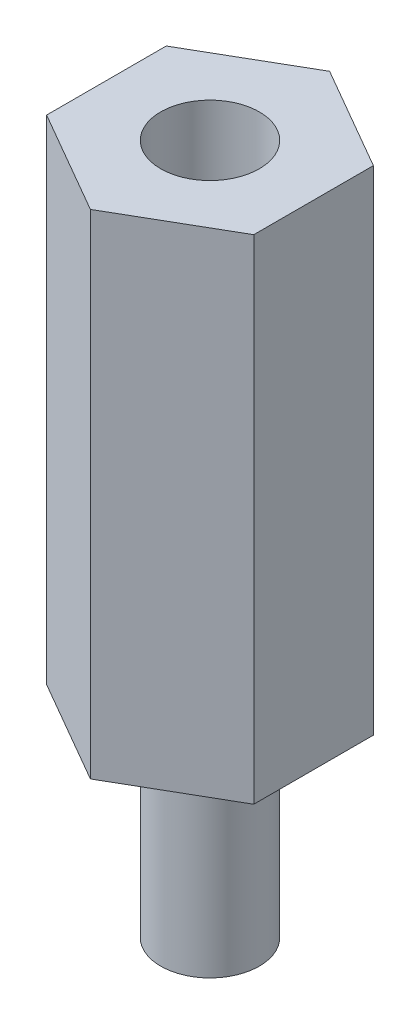
ISO-10303-21;
HEADER;
FILE_DESCRIPTION(('STEP AP214'),'2;1');
FILE_NAME('part.step','',(''),(''),'','','');
FILE_SCHEMA(('AUTOMOTIVE_DESIGN { 1 0 10303 214 1 1 1 1 }'));
ENDSEC;
DATA;
#1=APPLICATION_CONTEXT('core data for automotive mechanical design processes');
#2=APPLICATION_PROTOCOL_DEFINITION('international standard','automotive_design',2000,#1);
#3=PRODUCT_CONTEXT('',#1,'mechanical');
#4=PRODUCT('Part','Part','',(#3));
#5=PRODUCT_RELATED_PRODUCT_CATEGORY('part','',(#4));
#6=PRODUCT_DEFINITION_FORMATION('','',#4);
#7=PRODUCT_DEFINITION_CONTEXT('part definition',#1,'design');
#8=PRODUCT_DEFINITION('design','',#6,#7);
#9=PRODUCT_DEFINITION_SHAPE('','',#8);
#10=(LENGTH_UNIT() NAMED_UNIT(*) SI_UNIT(.MILLI.,.METRE.));
#11=(NAMED_UNIT(*) PLANE_ANGLE_UNIT() SI_UNIT($,.RADIAN.));
#12=(NAMED_UNIT(*) SI_UNIT($,.STERADIAN.) SOLID_ANGLE_UNIT());
#13=UNCERTAINTY_MEASURE_WITH_UNIT(LENGTH_MEASURE(1.E-05),#10,'distance_accuracy_value','');
#14=(GEOMETRIC_REPRESENTATION_CONTEXT(3) GLOBAL_UNCERTAINTY_ASSIGNED_CONTEXT((#13)) GLOBAL_UNIT_ASSIGNED_CONTEXT((#10,
#11,#12)) REPRESENTATION_CONTEXT('',''));
#15=CARTESIAN_POINT('',(0.,0.,0.));
#16=DIRECTION('',(0.,0.,1.));
#17=DIRECTION('',(1.,0.,0.));
#18=AXIS2_PLACEMENT_3D('',#15,#16,#17);
#19=CARTESIAN_POINT('',(3.15,15.,-1.81865334794732));
#20=DIRECTION('',(-0.5,0.,0.866025403784439));
#21=DIRECTION('',(0.866025403784439,0.,0.5));
#22=AXIS2_PLACEMENT_3D('',#19,#20,#21);
#23=PLANE('',#22);
#24=DIRECTION('',(-0.866025403784439,0.,-0.5));
#25=VECTOR('',#24,1.);
#26=CARTESIAN_POINT('',(3.15,0.,-1.81865334794732));
#27=LINE('',#26,#25);
#28=CARTESIAN_POINT('',(3.15,0.,-1.81865334794732));
#29=VERTEX_POINT('',#28);
#30=CARTESIAN_POINT('',(0.,0.,-3.63730669589464));
#31=VERTEX_POINT('',#30);
#32=EDGE_CURVE('E119',#29,#31,#27,.T.);
#33=ORIENTED_EDGE('',*,*,#32,.T.);
#34=DIRECTION('',(0.,-1.,0.));
#35=VECTOR('',#34,1.);
#36=CARTESIAN_POINT('',(0.,15.,-3.63730669589464));
#37=LINE('',#36,#35);
#38=CARTESIAN_POINT('',(0.,15.,-3.63730669589464));
#39=VERTEX_POINT('',#38);
#40=EDGE_CURVE('E36',#39,#31,#37,.T.);
#41=ORIENTED_EDGE('',*,*,#40,.F.);
#42=DIRECTION('',(-0.866025403784439,0.,-0.5));
#43=VECTOR('',#42,1.);
#44=CARTESIAN_POINT('',(3.15,15.,-1.81865334794732));
#45=LINE('',#44,#43);
#46=CARTESIAN_POINT('',(3.15,15.,-1.81865334794732));
#47=VERTEX_POINT('',#46);
#48=EDGE_CURVE('E130',#47,#39,#45,.T.);
#49=ORIENTED_EDGE('',*,*,#48,.F.);
#50=DIRECTION('',(0.,-1.,0.));
#51=VECTOR('',#50,1.);
#52=CARTESIAN_POINT('',(3.15,15.,-1.81865334794732));
#53=LINE('',#52,#51);
#54=EDGE_CURVE('E115',#47,#29,#53,.T.);
#55=ORIENTED_EDGE('',*,*,#54,.T.);
#56=EDGE_LOOP('',(#33,#41,#49,#55));
#57=FACE_BOUND('',#56,.T.);
#58=ADVANCED_FACE('F33',(#57),#23,.F.);
#59=CARTESIAN_POINT('',(0.,15.,-3.63730669589464));
#60=DIRECTION('',(0.5,0.,0.866025403784439));
#61=DIRECTION('',(0.866025403784439,0.,-0.5));
#62=AXIS2_PLACEMENT_3D('',#59,#60,#61);
#63=PLANE('',#62);
#64=DIRECTION('',(-0.866025403784439,0.,0.5));
#65=VECTOR('',#64,1.);
#66=CARTESIAN_POINT('',(0.,0.,-3.63730669589464));
#67=LINE('',#66,#65);
#68=CARTESIAN_POINT('',(-3.15,0.,-1.81865334794732));
#69=VERTEX_POINT('',#68);
#70=EDGE_CURVE('E122',#31,#69,#67,.T.);
#71=ORIENTED_EDGE('',*,*,#70,.T.);
#72=DIRECTION('',(0.,-1.,0.));
#73=VECTOR('',#72,1.);
#74=CARTESIAN_POINT('',(-3.15,15.,-1.81865334794732));
#75=LINE('',#74,#73);
#76=CARTESIAN_POINT('',(-3.15,15.,-1.81865334794732));
#77=VERTEX_POINT('',#76);
#78=EDGE_CURVE('E133',#77,#69,#75,.T.);
#79=ORIENTED_EDGE('',*,*,#78,.F.);
#80=DIRECTION('',(-0.866025403784439,0.,0.5));
#81=VECTOR('',#80,1.);
#82=CARTESIAN_POINT('',(0.,15.,-3.63730669589464));
#83=LINE('',#82,#81);
#84=EDGE_CURVE('E88',#39,#77,#83,.T.);
#85=ORIENTED_EDGE('',*,*,#84,.F.);
#86=ORIENTED_EDGE('',*,*,#40,.T.);
#87=EDGE_LOOP('',(#71,#79,#85,#86));
#88=FACE_BOUND('',#87,.T.);
#89=ADVANCED_FACE('F138',(#88),#63,.F.);
#90=CARTESIAN_POINT('',(-3.15,15.,-1.81865334794732));
#91=DIRECTION('',(1.,0.,0.));
#92=DIRECTION('',(0.,0.,-1.));
#93=AXIS2_PLACEMENT_3D('',#90,#91,#92);
#94=PLANE('',#93);
#95=DIRECTION('',(0.,0.,1.));
#96=VECTOR('',#95,1.);
#97=CARTESIAN_POINT('',(-3.15,0.,-1.81865334794732));
#98=LINE('',#97,#96);
#99=CARTESIAN_POINT('',(-3.15,0.,1.81865334794732));
#100=VERTEX_POINT('',#99);
#101=EDGE_CURVE('E125',#69,#100,#98,.T.);
#102=ORIENTED_EDGE('',*,*,#101,.T.);
#103=DIRECTION('',(0.,-1.,0.));
#104=VECTOR('',#103,1.);
#105=CARTESIAN_POINT('',(-3.15,15.,1.81865334794732));
#106=LINE('',#105,#104);
#107=CARTESIAN_POINT('',(-3.15,15.,1.81865334794732));
#108=VERTEX_POINT('',#107);
#109=EDGE_CURVE('E110',#108,#100,#106,.T.);
#110=ORIENTED_EDGE('',*,*,#109,.F.);
#111=DIRECTION('',(0.,0.,1.));
#112=VECTOR('',#111,1.);
#113=CARTESIAN_POINT('',(-3.15,15.,-1.81865334794732));
#114=LINE('',#113,#112);
#115=EDGE_CURVE('E101',#77,#108,#114,.T.);
#116=ORIENTED_EDGE('',*,*,#115,.F.);
#117=ORIENTED_EDGE('',*,*,#78,.T.);
#118=EDGE_LOOP('',(#102,#110,#116,#117));
#119=FACE_BOUND('',#118,.T.);
#120=ADVANCED_FACE('F144',(#119),#94,.F.);
#121=CARTESIAN_POINT('',(-3.15,15.,1.81865334794732));
#122=DIRECTION('',(0.5,0.,-0.866025403784439));
#123=DIRECTION('',(-0.866025403784439,0.,-0.5));
#124=AXIS2_PLACEMENT_3D('',#121,#122,#123);
#125=PLANE('',#124);
#126=DIRECTION('',(0.866025403784439,0.,0.5));
#127=VECTOR('',#126,1.);
#128=CARTESIAN_POINT('',(-3.15,0.,1.81865334794732));
#129=LINE('',#128,#127);
#130=CARTESIAN_POINT('',(0.,0.,3.63730669589464));
#131=VERTEX_POINT('',#130);
#132=EDGE_CURVE('E109',#100,#131,#129,.T.);
#133=ORIENTED_EDGE('',*,*,#132,.T.);
#134=DIRECTION('',(0.,-1.,0.));
#135=VECTOR('',#134,1.);
#136=CARTESIAN_POINT('',(0.,15.,3.63730669589464));
#137=LINE('',#136,#135);
#138=CARTESIAN_POINT('',(0.,15.,3.63730669589464));
#139=VERTEX_POINT('',#138);
#140=EDGE_CURVE('E106',#139,#131,#137,.T.);
#141=ORIENTED_EDGE('',*,*,#140,.F.);
#142=DIRECTION('',(0.866025403784439,0.,0.5));
#143=VECTOR('',#142,1.);
#144=CARTESIAN_POINT('',(-3.15,15.,1.81865334794732));
#145=LINE('',#144,#143);
#146=EDGE_CURVE('E95',#108,#139,#145,.T.);
#147=ORIENTED_EDGE('',*,*,#146,.F.);
#148=ORIENTED_EDGE('',*,*,#109,.T.);
#149=EDGE_LOOP('',(#133,#141,#147,#148));
#150=FACE_BOUND('',#149,.T.);
#151=ADVANCED_FACE('F107',(#150),#125,.F.);
#152=CARTESIAN_POINT('',(0.,15.,3.63730669589464));
#153=DIRECTION('',(-0.5,0.,-0.866025403784439));
#154=DIRECTION('',(-0.866025403784439,0.,0.5));
#155=AXIS2_PLACEMENT_3D('',#152,#153,#154);
#156=PLANE('',#155);
#157=DIRECTION('',(0.866025403784439,0.,-0.5));
#158=VECTOR('',#157,1.);
#159=CARTESIAN_POINT('',(0.,0.,3.63730669589464));
#160=LINE('',#159,#158);
#161=CARTESIAN_POINT('',(3.15,0.,1.81865334794732));
#162=VERTEX_POINT('',#161);
#163=EDGE_CURVE('E73',#131,#162,#160,.T.);
#164=ORIENTED_EDGE('',*,*,#163,.T.);
#165=DIRECTION('',(0.,-1.,0.));
#166=VECTOR('',#165,1.);
#167=CARTESIAN_POINT('',(3.15,15.,1.81865334794732));
#168=LINE('',#167,#166);
#169=CARTESIAN_POINT('',(3.15,15.,1.81865334794732));
#170=VERTEX_POINT('',#169);
#171=EDGE_CURVE('E111',#170,#162,#168,.T.);
#172=ORIENTED_EDGE('',*,*,#171,.F.);
#173=DIRECTION('',(0.866025403784439,0.,-0.5));
#174=VECTOR('',#173,1.);
#175=CARTESIAN_POINT('',(0.,15.,3.63730669589464));
#176=LINE('',#175,#174);
#177=EDGE_CURVE('E99',#139,#170,#176,.T.);
#178=ORIENTED_EDGE('',*,*,#177,.F.);
#179=ORIENTED_EDGE('',*,*,#140,.T.);
#180=EDGE_LOOP('',(#164,#172,#178,#179));
#181=FACE_BOUND('',#180,.T.);
#182=ADVANCED_FACE('F113',(#181),#156,.F.);
#183=CARTESIAN_POINT('',(3.15,15.,1.81865334794732));
#184=DIRECTION('',(-1.,0.,0.));
#185=DIRECTION('',(0.,0.,1.));
#186=AXIS2_PLACEMENT_3D('',#183,#184,#185);
#187=PLANE('',#186);
#188=DIRECTION('',(0.,0.,-1.));
#189=VECTOR('',#188,1.);
#190=CARTESIAN_POINT('',(3.15,0.,1.81865334794732));
#191=LINE('',#190,#189);
#192=EDGE_CURVE('E79',#162,#29,#191,.T.);
#193=ORIENTED_EDGE('',*,*,#192,.T.);
#194=ORIENTED_EDGE('',*,*,#54,.F.);
#195=DIRECTION('',(0.,0.,-1.));
#196=VECTOR('',#195,1.);
#197=CARTESIAN_POINT('',(3.15,15.,1.81865334794732));
#198=LINE('',#197,#196);
#199=EDGE_CURVE('E50',#170,#47,#198,.T.);
#200=ORIENTED_EDGE('',*,*,#199,.F.);
#201=ORIENTED_EDGE('',*,*,#171,.T.);
#202=EDGE_LOOP('',(#193,#194,#200,#201));
#203=FACE_BOUND('',#202,.T.);
#204=ADVANCED_FACE('F167',(#203),#187,.F.);
#205=CARTESIAN_POINT('',(0.,15.,0.));
#206=DIRECTION('',(0.,1.,0.));
#207=DIRECTION('',(0.,0.,1.));
#208=AXIS2_PLACEMENT_3D('',#205,#206,#207);
#209=PLANE('',#208);
#210=CARTESIAN_POINT('',(0.,15.,0.));
#211=DIRECTION('',(0.,1.,0.));
#212=DIRECTION('',(0.,0.,1.));
#213=AXIS2_PLACEMENT_3D('',#210,#211,#212);
#214=CIRCLE('',#213,1.5);
#215=CARTESIAN_POINT('',(0.,15.,1.5));
#216=VERTEX_POINT('',#215);
#217=EDGE_CURVE('E151',#216,#216,#214,.T.);
#218=ORIENTED_EDGE('',*,*,#217,.F.);
#219=EDGE_LOOP('',(#218));
#220=FACE_BOUND('',#219,.T.);
#221=ORIENTED_EDGE('',*,*,#48,.T.);
#222=ORIENTED_EDGE('',*,*,#84,.T.);
#223=ORIENTED_EDGE('',*,*,#115,.T.);
#224=ORIENTED_EDGE('',*,*,#146,.T.);
#225=ORIENTED_EDGE('',*,*,#177,.T.);
#226=ORIENTED_EDGE('',*,*,#199,.T.);
#227=EDGE_LOOP('',(#221,#222,#223,#224,#225,#226));
#228=FACE_BOUND('',#227,.T.);
#229=ADVANCED_FACE('F97',(#220,#228),#209,.T.);
#230=CARTESIAN_POINT('',(0.,0.,0.));
#231=DIRECTION('',(0.,1.,0.));
#232=DIRECTION('',(0.,0.,1.));
#233=AXIS2_PLACEMENT_3D('',#230,#231,#232);
#234=PLANE('',#233);
#235=CARTESIAN_POINT('',(0.,0.,0.));
#236=DIRECTION('',(0.,-1.,0.));
#237=DIRECTION('',(0.,0.,-1.));
#238=AXIS2_PLACEMENT_3D('',#235,#236,#237);
#239=CIRCLE('',#238,1.5);
#240=CARTESIAN_POINT('',(0.,0.,-1.5));
#241=VERTEX_POINT('',#240);
#242=EDGE_CURVE('E11',#241,#241,#239,.T.);
#243=ORIENTED_EDGE('',*,*,#242,.F.);
#244=EDGE_LOOP('',(#243));
#245=FACE_BOUND('',#244,.T.);
#246=ORIENTED_EDGE('',*,*,#32,.F.);
#247=ORIENTED_EDGE('',*,*,#192,.F.);
#248=ORIENTED_EDGE('',*,*,#163,.F.);
#249=ORIENTED_EDGE('',*,*,#132,.F.);
#250=ORIENTED_EDGE('',*,*,#101,.F.);
#251=ORIENTED_EDGE('',*,*,#70,.F.);
#252=EDGE_LOOP('',(#246,#247,#248,#249,#250,#251));
#253=FACE_BOUND('',#252,.T.);
#254=ADVANCED_FACE('F143',(#245,#253),#234,.F.);
#255=CARTESIAN_POINT('',(0.,-6.,0.));
#256=DIRECTION('',(0.,1.,0.));
#257=DIRECTION('',(0.,0.,1.));
#258=AXIS2_PLACEMENT_3D('',#255,#256,#257);
#259=CYLINDRICAL_SURFACE('',#258,1.5);
#260=CARTESIAN_POINT('',(0.,-6.,0.));
#261=DIRECTION('',(0.,-1.,0.));
#262=DIRECTION('',(0.,0.,-1.));
#263=AXIS2_PLACEMENT_3D('',#260,#261,#262);
#264=CIRCLE('',#263,1.5);
#265=CARTESIAN_POINT('',(0.,-6.,-1.5));
#266=VERTEX_POINT('',#265);
#267=EDGE_CURVE('E123',#266,#266,#264,.T.);
#268=ORIENTED_EDGE('',*,*,#267,.F.);
#269=EDGE_LOOP('',(#268));
#270=FACE_BOUND('',#269,.T.);
#271=ORIENTED_EDGE('',*,*,#242,.T.);
#272=EDGE_LOOP('',(#271));
#273=FACE_BOUND('',#272,.T.);
#274=ADVANCED_FACE('F173',(#270,#273),#259,.T.);
#275=CARTESIAN_POINT('',(0.,-6.,0.));
#276=DIRECTION('',(0.,-1.,0.));
#277=DIRECTION('',(0.,0.,-1.));
#278=AXIS2_PLACEMENT_3D('',#275,#276,#277);
#279=PLANE('',#278);
#280=ORIENTED_EDGE('',*,*,#267,.T.);
#281=EDGE_LOOP('',(#280));
#282=FACE_BOUND('',#281,.T.);
#283=ADVANCED_FACE('F162',(#282),#279,.T.);
#284=CARTESIAN_POINT('',(0.,12.,0.));
#285=DIRECTION('',(0.,1.,0.));
#286=DIRECTION('',(0.,0.,1.));
#287=AXIS2_PLACEMENT_3D('',#284,#285,#286);
#288=CYLINDRICAL_SURFACE('',#287,1.5);
#289=CARTESIAN_POINT('',(0.,12.,0.));
#290=DIRECTION('',(0.,1.,0.));
#291=DIRECTION('',(0.,0.,1.));
#292=AXIS2_PLACEMENT_3D('',#289,#290,#291);
#293=CIRCLE('',#292,1.5);
#294=CARTESIAN_POINT('',(0.,12.,1.5));
#295=VERTEX_POINT('',#294);
#296=EDGE_CURVE('E150',#295,#295,#293,.T.);
#297=ORIENTED_EDGE('',*,*,#296,.F.);
#298=EDGE_LOOP('',(#297));
#299=FACE_BOUND('',#298,.T.);
#300=ORIENTED_EDGE('',*,*,#217,.T.);
#301=EDGE_LOOP('',(#300));
#302=FACE_BOUND('',#301,.T.);
#303=ADVANCED_FACE('F159',(#299,#302),#288,.F.);
#304=CARTESIAN_POINT('',(0.,12.,0.));
#305=DIRECTION('',(0.,1.,0.));
#306=DIRECTION('',(0.,0.,1.));
#307=AXIS2_PLACEMENT_3D('',#304,#305,#306);
#308=PLANE('',#307);
#309=ORIENTED_EDGE('',*,*,#296,.T.);
#310=EDGE_LOOP('',(#309));
#311=FACE_BOUND('',#310,.T.);
#312=ADVANCED_FACE('F157',(#311),#308,.T.);
#313=CLOSED_SHELL('',(#58,#89,#120,#151,#182,#204,#229,#254,#274,#283,#303,#312));
#314=MANIFOLD_SOLID_BREP('B2',#313);
#315=ADVANCED_BREP_SHAPE_REPRESENTATION('',(#18,#314),#14);
#316=SHAPE_DEFINITION_REPRESENTATION(#9,#315);
ENDSEC;
END-ISO-10303-21;
